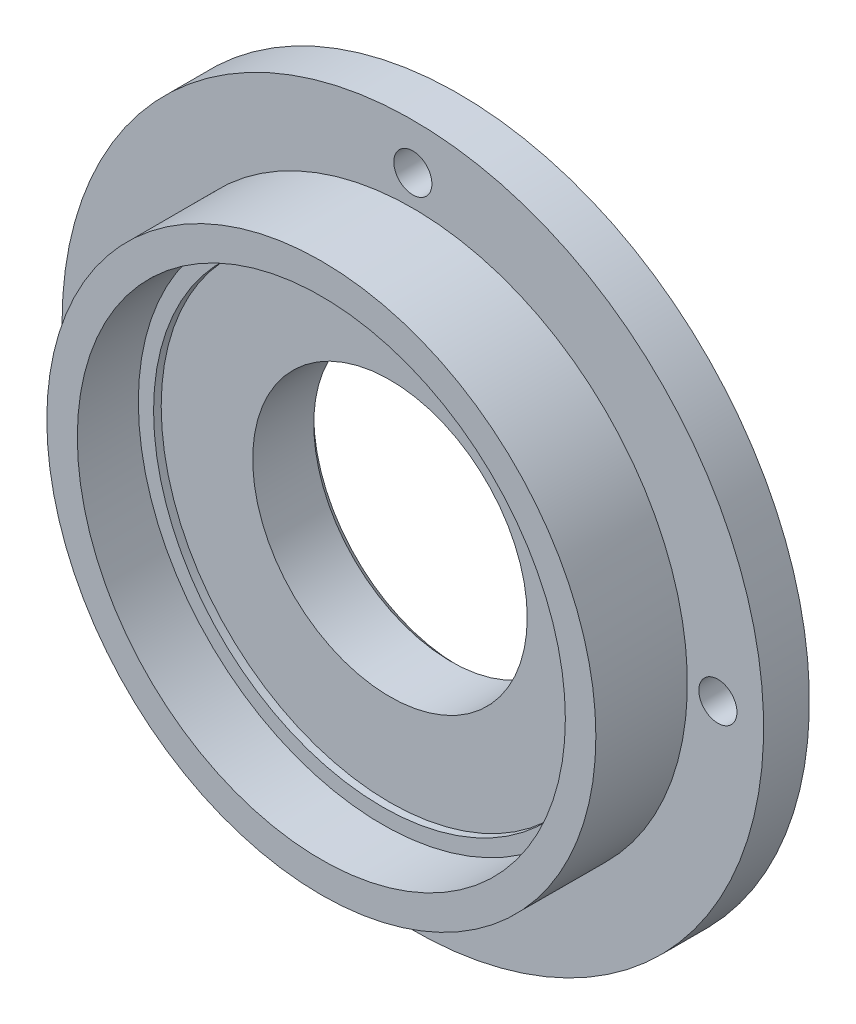
ISO-10303-21;
HEADER;
FILE_DESCRIPTION(('STEP AP214'),'2;1');
FILE_NAME('part.step','',(''),(''),'','','');
FILE_SCHEMA(('AUTOMOTIVE_DESIGN { 1 0 10303 214 1 1 1 1 }'));
ENDSEC;
DATA;
#1=APPLICATION_CONTEXT('core data for automotive mechanical design processes');
#2=APPLICATION_PROTOCOL_DEFINITION('international standard','automotive_design',2000,#1);
#3=PRODUCT_CONTEXT('',#1,'mechanical');
#4=PRODUCT('Part','Part','',(#3));
#5=PRODUCT_RELATED_PRODUCT_CATEGORY('part','',(#4));
#6=PRODUCT_DEFINITION_FORMATION('','',#4);
#7=PRODUCT_DEFINITION_CONTEXT('part definition',#1,'design');
#8=PRODUCT_DEFINITION('design','',#6,#7);
#9=PRODUCT_DEFINITION_SHAPE('','',#8);
#10=(LENGTH_UNIT() NAMED_UNIT(*) SI_UNIT(.MILLI.,.METRE.));
#11=(NAMED_UNIT(*) PLANE_ANGLE_UNIT() SI_UNIT($,.RADIAN.));
#12=(NAMED_UNIT(*) SI_UNIT($,.STERADIAN.) SOLID_ANGLE_UNIT());
#13=UNCERTAINTY_MEASURE_WITH_UNIT(LENGTH_MEASURE(1.E-05),#10,'distance_accuracy_value','');
#14=(GEOMETRIC_REPRESENTATION_CONTEXT(3) GLOBAL_UNCERTAINTY_ASSIGNED_CONTEXT((#13)) GLOBAL_UNIT_ASSIGNED_CONTEXT((#10,
#11,#12)) REPRESENTATION_CONTEXT('',''));
#15=CARTESIAN_POINT('',(0.,0.,0.));
#16=DIRECTION('',(0.,0.,1.));
#17=DIRECTION('',(1.,0.,0.));
#18=AXIS2_PLACEMENT_3D('',#15,#16,#17);
#19=CARTESIAN_POINT('',(0.,0.,0.));
#20=DIRECTION('',(0.,0.,1.));
#21=DIRECTION('',(1.,0.,0.));
#22=AXIS2_PLACEMENT_3D('',#19,#20,#21);
#23=PLANE('',#22);
#24=CARTESIAN_POINT('',(-20.,0.,0.));
#25=DIRECTION('',(0.,0.,-1.));
#26=DIRECTION('',(-1.,0.,0.));
#27=AXIS2_PLACEMENT_3D('',#24,#25,#26);
#28=CIRCLE('',#27,1.24999999999999);
#29=CARTESIAN_POINT('',(-21.25,0.,0.));
#30=VERTEX_POINT('',#29);
#31=EDGE_CURVE('E96',#30,#30,#28,.T.);
#32=ORIENTED_EDGE('',*,*,#31,.F.);
#33=EDGE_LOOP('',(#32));
#34=FACE_BOUND('',#33,.T.);
#35=CARTESIAN_POINT('',(0.,0.,0.));
#36=DIRECTION('',(0.,0.,1.));
#37=DIRECTION('',(1.,0.,0.));
#38=AXIS2_PLACEMENT_3D('',#35,#36,#37);
#39=CIRCLE('',#38,9.5);
#40=CARTESIAN_POINT('',(9.5,0.,0.));
#41=VERTEX_POINT('',#40);
#42=EDGE_CURVE('E48',#41,#41,#39,.T.);
#43=ORIENTED_EDGE('',*,*,#42,.T.);
#44=EDGE_LOOP('',(#43));
#45=FACE_BOUND('',#44,.T.);
#46=CARTESIAN_POINT('',(0.,0.,0.));
#47=DIRECTION('',(0.,0.,-1.));
#48=DIRECTION('',(-1.,0.,0.));
#49=AXIS2_PLACEMENT_3D('',#46,#47,#48);
#50=CIRCLE('',#49,23.);
#51=CARTESIAN_POINT('',(-23.,0.,0.));
#52=VERTEX_POINT('',#51);
#53=EDGE_CURVE('E87',#52,#52,#50,.T.);
#54=ORIENTED_EDGE('',*,*,#53,.T.);
#55=EDGE_LOOP('',(#54));
#56=FACE_BOUND('',#55,.T.);
#57=CARTESIAN_POINT('',(0.,-20.,0.));
#58=DIRECTION('',(0.,0.,-1.));
#59=DIRECTION('',(-1.,0.,0.));
#60=AXIS2_PLACEMENT_3D('',#57,#58,#59);
#61=CIRCLE('',#60,1.24999999999999);
#62=CARTESIAN_POINT('',(-1.24999999999999,-20.,0.));
#63=VERTEX_POINT('',#62);
#64=EDGE_CURVE('E104',#63,#63,#61,.T.);
#65=ORIENTED_EDGE('',*,*,#64,.F.);
#66=EDGE_LOOP('',(#65));
#67=FACE_BOUND('',#66,.T.);
#68=CARTESIAN_POINT('',(20.,0.,0.));
#69=DIRECTION('',(0.,0.,-1.));
#70=DIRECTION('',(-1.,0.,0.));
#71=AXIS2_PLACEMENT_3D('',#68,#69,#70);
#72=CIRCLE('',#71,1.24999999999999);
#73=CARTESIAN_POINT('',(18.75,0.,0.));
#74=VERTEX_POINT('',#73);
#75=EDGE_CURVE('E112',#74,#74,#72,.T.);
#76=ORIENTED_EDGE('',*,*,#75,.F.);
#77=EDGE_LOOP('',(#76));
#78=FACE_BOUND('',#77,.T.);
#79=CARTESIAN_POINT('',(0.,20.,0.));
#80=DIRECTION('',(0.,0.,-1.));
#81=DIRECTION('',(-1.,0.,0.));
#82=AXIS2_PLACEMENT_3D('',#79,#80,#81);
#83=CIRCLE('',#82,1.24999999999999);
#84=CARTESIAN_POINT('',(-1.24999999999999,20.,0.));
#85=VERTEX_POINT('',#84);
#86=EDGE_CURVE('E120',#85,#85,#83,.T.);
#87=ORIENTED_EDGE('',*,*,#86,.F.);
#88=EDGE_LOOP('',(#87));
#89=FACE_BOUND('',#88,.T.);
#90=ADVANCED_FACE('F40',(#34,#45,#56,#67,#78,#89),#23,.F.);
#91=CARTESIAN_POINT('',(0.,0.,9.));
#92=DIRECTION('',(0.,0.,-1.));
#93=DIRECTION('',(-1.,0.,0.));
#94=AXIS2_PLACEMENT_3D('',#91,#92,#93);
#95=CYLINDRICAL_SURFACE('',#94,18.);
#96=CARTESIAN_POINT('',(0.,0.,9.));
#97=DIRECTION('',(0.,0.,1.));
#98=DIRECTION('',(1.,0.,0.));
#99=AXIS2_PLACEMENT_3D('',#96,#97,#98);
#100=CIRCLE('',#99,18.);
#101=CARTESIAN_POINT('',(18.,0.,9.));
#102=VERTEX_POINT('',#101);
#103=EDGE_CURVE('E62',#102,#102,#100,.T.);
#104=ORIENTED_EDGE('',*,*,#103,.F.);
#105=EDGE_LOOP('',(#104));
#106=FACE_BOUND('',#105,.T.);
#107=CARTESIAN_POINT('',(0.,0.,3.));
#108=DIRECTION('',(0.,0.,-1.));
#109=DIRECTION('',(-1.,0.,0.));
#110=AXIS2_PLACEMENT_3D('',#107,#108,#109);
#111=CIRCLE('',#110,18.);
#112=CARTESIAN_POINT('',(-18.,0.,3.));
#113=VERTEX_POINT('',#112);
#114=EDGE_CURVE('E55',#113,#113,#111,.T.);
#115=ORIENTED_EDGE('',*,*,#114,.F.);
#116=EDGE_LOOP('',(#115));
#117=FACE_BOUND('',#116,.T.);
#118=ADVANCED_FACE('F128',(#106,#117),#95,.T.);
#119=CARTESIAN_POINT('',(0.,0.,9.));
#120=DIRECTION('',(0.,0.,1.));
#121=DIRECTION('',(1.,0.,0.));
#122=AXIS2_PLACEMENT_3D('',#119,#120,#121);
#123=PLANE('',#122);
#124=CARTESIAN_POINT('',(0.,0.,9.));
#125=DIRECTION('',(0.,0.,1.));
#126=DIRECTION('',(1.,0.,0.));
#127=AXIS2_PLACEMENT_3D('',#124,#125,#126);
#128=CIRCLE('',#127,16.);
#129=CARTESIAN_POINT('',(16.,0.,9.));
#130=VERTEX_POINT('',#129);
#131=EDGE_CURVE('E69',#130,#130,#128,.T.);
#132=ORIENTED_EDGE('',*,*,#131,.F.);
#133=EDGE_LOOP('',(#132));
#134=FACE_BOUND('',#133,.T.);
#135=ORIENTED_EDGE('',*,*,#103,.T.);
#136=EDGE_LOOP('',(#135));
#137=FACE_BOUND('',#136,.T.);
#138=ADVANCED_FACE('F134',(#134,#137),#123,.T.);
#139=CARTESIAN_POINT('',(0.,0.,5.));
#140=DIRECTION('',(0.,0.,1.));
#141=DIRECTION('',(1.,0.,0.));
#142=AXIS2_PLACEMENT_3D('',#139,#140,#141);
#143=CYLINDRICAL_SURFACE('',#142,16.);
#144=CARTESIAN_POINT('',(0.,0.,5.));
#145=DIRECTION('',(0.,0.,1.));
#146=DIRECTION('',(1.,0.,0.));
#147=AXIS2_PLACEMENT_3D('',#144,#145,#146);
#148=CIRCLE('',#147,16.);
#149=CARTESIAN_POINT('',(16.,0.,5.));
#150=VERTEX_POINT('',#149);
#151=EDGE_CURVE('E68',#150,#150,#148,.T.);
#152=ORIENTED_EDGE('',*,*,#151,.F.);
#153=EDGE_LOOP('',(#152));
#154=FACE_BOUND('',#153,.T.);
#155=ORIENTED_EDGE('',*,*,#131,.T.);
#156=EDGE_LOOP('',(#155));
#157=FACE_BOUND('',#156,.T.);
#158=ADVANCED_FACE('F140',(#154,#157),#143,.F.);
#159=CARTESIAN_POINT('',(0.,0.,5.));
#160=DIRECTION('',(0.,0.,1.));
#161=DIRECTION('',(1.,0.,0.));
#162=AXIS2_PLACEMENT_3D('',#159,#160,#161);
#163=PLANE('',#162);
#164=CARTESIAN_POINT('',(0.,0.,5.));
#165=DIRECTION('',(0.,0.,1.));
#166=DIRECTION('',(1.,0.,0.));
#167=AXIS2_PLACEMENT_3D('',#164,#165,#166);
#168=CIRCLE('',#167,15.);
#169=CARTESIAN_POINT('',(15.,0.,5.));
#170=VERTEX_POINT('',#169);
#171=EDGE_CURVE('E77',#170,#170,#168,.T.);
#172=ORIENTED_EDGE('',*,*,#171,.F.);
#173=EDGE_LOOP('',(#172));
#174=FACE_BOUND('',#173,.T.);
#175=ORIENTED_EDGE('',*,*,#151,.T.);
#176=EDGE_LOOP('',(#175));
#177=FACE_BOUND('',#176,.T.);
#178=ADVANCED_FACE('F144',(#174,#177),#163,.T.);
#179=CARTESIAN_POINT('',(0.,0.,4.5));
#180=DIRECTION('',(0.,0.,1.));
#181=DIRECTION('',(1.,0.,0.));
#182=AXIS2_PLACEMENT_3D('',#179,#180,#181);
#183=CYLINDRICAL_SURFACE('',#182,15.);
#184=CARTESIAN_POINT('',(0.,0.,4.5));
#185=DIRECTION('',(0.,0.,1.));
#186=DIRECTION('',(1.,0.,0.));
#187=AXIS2_PLACEMENT_3D('',#184,#185,#186);
#188=CIRCLE('',#187,15.);
#189=CARTESIAN_POINT('',(15.,0.,4.5));
#190=VERTEX_POINT('',#189);
#191=EDGE_CURVE('E73',#190,#190,#188,.T.);
#192=ORIENTED_EDGE('',*,*,#191,.F.);
#193=EDGE_LOOP('',(#192));
#194=FACE_BOUND('',#193,.T.);
#195=ORIENTED_EDGE('',*,*,#171,.T.);
#196=EDGE_LOOP('',(#195));
#197=FACE_BOUND('',#196,.T.);
#198=ADVANCED_FACE('F148',(#194,#197),#183,.F.);
#199=CARTESIAN_POINT('',(0.,0.,4.5));
#200=DIRECTION('',(0.,0.,1.));
#201=DIRECTION('',(1.,0.,0.));
#202=AXIS2_PLACEMENT_3D('',#199,#200,#201);
#203=PLANE('',#202);
#204=CARTESIAN_POINT('',(0.,0.,4.5));
#205=DIRECTION('',(0.,0.,1.));
#206=DIRECTION('',(1.,0.,0.));
#207=AXIS2_PLACEMENT_3D('',#204,#205,#206);
#208=CIRCLE('',#207,9.);
#209=CARTESIAN_POINT('',(9.,0.,4.5));
#210=VERTEX_POINT('',#209);
#211=EDGE_CURVE('E80',#210,#210,#208,.T.);
#212=ORIENTED_EDGE('',*,*,#211,.F.);
#213=EDGE_LOOP('',(#212));
#214=FACE_BOUND('',#213,.T.);
#215=ORIENTED_EDGE('',*,*,#191,.T.);
#216=EDGE_LOOP('',(#215));
#217=FACE_BOUND('',#216,.T.);
#218=ADVANCED_FACE('F152',(#214,#217),#203,.T.);
#219=CARTESIAN_POINT('',(0.,0.,0.));
#220=DIRECTION('',(0.,0.,1.));
#221=DIRECTION('',(1.,0.,0.));
#222=AXIS2_PLACEMENT_3D('',#219,#220,#221);
#223=CYLINDRICAL_SURFACE('',#222,9.);
#224=CARTESIAN_POINT('',(0.,0.,0.500000000000006));
#225=DIRECTION('',(0.,0.,1.));
#226=DIRECTION('',(1.,0.,0.));
#227=AXIS2_PLACEMENT_3D('',#224,#225,#226);
#228=CIRCLE('',#227,9.);
#229=CARTESIAN_POINT('',(9.,0.,0.500000000000006));
#230=VERTEX_POINT('',#229);
#231=EDGE_CURVE('E10',#230,#230,#228,.F.);
#232=ORIENTED_EDGE('',*,*,#231,.T.);
#233=EDGE_LOOP('',(#232));
#234=FACE_BOUND('',#233,.T.);
#235=ORIENTED_EDGE('',*,*,#211,.T.);
#236=EDGE_LOOP('',(#235));
#237=FACE_BOUND('',#236,.T.);
#238=ADVANCED_FACE('F156',(#234,#237),#223,.F.);
#239=CARTESIAN_POINT('',(0.,0.,3.));
#240=DIRECTION('',(0.,0.,-1.));
#241=DIRECTION('',(-1.,0.,0.));
#242=AXIS2_PLACEMENT_3D('',#239,#240,#241);
#243=CYLINDRICAL_SURFACE('',#242,23.);
#244=CARTESIAN_POINT('',(0.,0.,3.));
#245=DIRECTION('',(0.,0.,-1.));
#246=DIRECTION('',(-1.,0.,0.));
#247=AXIS2_PLACEMENT_3D('',#244,#245,#246);
#248=CIRCLE('',#247,23.);
#249=CARTESIAN_POINT('',(-23.,0.,3.));
#250=VERTEX_POINT('',#249);
#251=EDGE_CURVE('E86',#250,#250,#248,.T.);
#252=ORIENTED_EDGE('',*,*,#251,.T.);
#253=EDGE_LOOP('',(#252));
#254=FACE_BOUND('',#253,.T.);
#255=ORIENTED_EDGE('',*,*,#53,.F.);
#256=EDGE_LOOP('',(#255));
#257=FACE_BOUND('',#256,.T.);
#258=ADVANCED_FACE('F160',(#254,#257),#243,.T.);
#259=CARTESIAN_POINT('',(0.,0.,3.));
#260=DIRECTION('',(0.,0.,-1.));
#261=DIRECTION('',(-1.,0.,0.));
#262=AXIS2_PLACEMENT_3D('',#259,#260,#261);
#263=PLANE('',#262);
#264=CARTESIAN_POINT('',(0.,20.,3.));
#265=DIRECTION('',(0.,0.,-1.));
#266=DIRECTION('',(-1.,0.,0.));
#267=AXIS2_PLACEMENT_3D('',#264,#265,#266);
#268=CIRCLE('',#267,1.24999999999999);
#269=CARTESIAN_POINT('',(-1.24999999999999,20.,3.));
#270=VERTEX_POINT('',#269);
#271=EDGE_CURVE('E116',#270,#270,#268,.T.);
#272=ORIENTED_EDGE('',*,*,#271,.T.);
#273=EDGE_LOOP('',(#272));
#274=FACE_BOUND('',#273,.T.);
#275=CARTESIAN_POINT('',(20.,0.,3.));
#276=DIRECTION('',(0.,0.,-1.));
#277=DIRECTION('',(-1.,0.,0.));
#278=AXIS2_PLACEMENT_3D('',#275,#276,#277);
#279=CIRCLE('',#278,1.24999999999999);
#280=CARTESIAN_POINT('',(18.75,0.,3.));
#281=VERTEX_POINT('',#280);
#282=EDGE_CURVE('E108',#281,#281,#279,.T.);
#283=ORIENTED_EDGE('',*,*,#282,.T.);
#284=EDGE_LOOP('',(#283));
#285=FACE_BOUND('',#284,.T.);
#286=CARTESIAN_POINT('',(0.,-20.,3.));
#287=DIRECTION('',(0.,0.,-1.));
#288=DIRECTION('',(-1.,0.,0.));
#289=AXIS2_PLACEMENT_3D('',#286,#287,#288);
#290=CIRCLE('',#289,1.24999999999999);
#291=CARTESIAN_POINT('',(-1.25,-20.,3.));
#292=VERTEX_POINT('',#291);
#293=EDGE_CURVE('E100',#292,#292,#290,.T.);
#294=ORIENTED_EDGE('',*,*,#293,.T.);
#295=EDGE_LOOP('',(#294));
#296=FACE_BOUND('',#295,.T.);
#297=CARTESIAN_POINT('',(-20.,0.,3.));
#298=DIRECTION('',(0.,0.,-1.));
#299=DIRECTION('',(-1.,0.,0.));
#300=AXIS2_PLACEMENT_3D('',#297,#298,#299);
#301=CIRCLE('',#300,1.24999999999999);
#302=CARTESIAN_POINT('',(-21.25,0.,3.));
#303=VERTEX_POINT('',#302);
#304=EDGE_CURVE('E90',#303,#303,#301,.T.);
#305=ORIENTED_EDGE('',*,*,#304,.T.);
#306=EDGE_LOOP('',(#305));
#307=FACE_BOUND('',#306,.T.);
#308=ORIENTED_EDGE('',*,*,#114,.T.);
#309=EDGE_LOOP('',(#308));
#310=FACE_BOUND('',#309,.T.);
#311=ORIENTED_EDGE('',*,*,#251,.F.);
#312=EDGE_LOOP('',(#311));
#313=FACE_BOUND('',#312,.T.);
#314=ADVANCED_FACE('F163',(#274,#285,#296,#307,#310,#313),#263,.F.);
#315=CARTESIAN_POINT('',(0.,0.,0.));
#316=DIRECTION('',(0.,0.,-1.));
#317=DIRECTION('',(-1.,0.,0.));
#318=AXIS2_PLACEMENT_3D('',#315,#316,#317);
#319=CONICAL_SURFACE('',#318,9.5,0.785398163397445);
#320=ORIENTED_EDGE('',*,*,#231,.F.);
#321=EDGE_LOOP('',(#320));
#322=FACE_BOUND('',#321,.T.);
#323=ORIENTED_EDGE('',*,*,#42,.F.);
#324=EDGE_LOOP('',(#323));
#325=FACE_BOUND('',#324,.T.);
#326=ADVANCED_FACE('F42',(#322,#325),#319,.F.);
#327=CARTESIAN_POINT('',(-20.,0.,0.));
#328=DIRECTION('',(0.,0.,-1.));
#329=DIRECTION('',(-1.,0.,0.));
#330=AXIS2_PLACEMENT_3D('',#327,#328,#329);
#331=CYLINDRICAL_SURFACE('',#330,1.24999999999999);
#332=ORIENTED_EDGE('',*,*,#304,.F.);
#333=EDGE_LOOP('',(#332));
#334=FACE_BOUND('',#333,.T.);
#335=ORIENTED_EDGE('',*,*,#31,.T.);
#336=EDGE_LOOP('',(#335));
#337=FACE_BOUND('',#336,.T.);
#338=ADVANCED_FACE('F168',(#334,#337),#331,.F.);
#339=CARTESIAN_POINT('',(0.,-20.,0.));
#340=DIRECTION('',(0.,0.,-1.));
#341=DIRECTION('',(-1.,0.,0.));
#342=AXIS2_PLACEMENT_3D('',#339,#340,#341);
#343=CYLINDRICAL_SURFACE('',#342,1.24999999999999);
#344=ORIENTED_EDGE('',*,*,#293,.F.);
#345=EDGE_LOOP('',(#344));
#346=FACE_BOUND('',#345,.T.);
#347=ORIENTED_EDGE('',*,*,#64,.T.);
#348=EDGE_LOOP('',(#347));
#349=FACE_BOUND('',#348,.T.);
#350=ADVANCED_FACE('F171',(#346,#349),#343,.F.);
#351=CARTESIAN_POINT('',(20.,0.,0.));
#352=DIRECTION('',(0.,0.,-1.));
#353=DIRECTION('',(-1.,0.,0.));
#354=AXIS2_PLACEMENT_3D('',#351,#352,#353);
#355=CYLINDRICAL_SURFACE('',#354,1.24999999999999);
#356=ORIENTED_EDGE('',*,*,#282,.F.);
#357=EDGE_LOOP('',(#356));
#358=FACE_BOUND('',#357,.T.);
#359=ORIENTED_EDGE('',*,*,#75,.T.);
#360=EDGE_LOOP('',(#359));
#361=FACE_BOUND('',#360,.T.);
#362=ADVANCED_FACE('F175',(#358,#361),#355,.F.);
#363=CARTESIAN_POINT('',(0.,20.,0.));
#364=DIRECTION('',(0.,0.,-1.));
#365=DIRECTION('',(-1.,0.,0.));
#366=AXIS2_PLACEMENT_3D('',#363,#364,#365);
#367=CYLINDRICAL_SURFACE('',#366,1.24999999999999);
#368=ORIENTED_EDGE('',*,*,#271,.F.);
#369=EDGE_LOOP('',(#368));
#370=FACE_BOUND('',#369,.T.);
#371=ORIENTED_EDGE('',*,*,#86,.T.);
#372=EDGE_LOOP('',(#371));
#373=FACE_BOUND('',#372,.T.);
#374=ADVANCED_FACE('F125',(#370,#373),#367,.F.);
#375=CLOSED_SHELL('',(#90,#118,#138,#158,#178,#198,#218,#238,#258,#314,#326,#338,#350,#362,#374));
#376=MANIFOLD_SOLID_BREP('B2',#375);
#377=ADVANCED_BREP_SHAPE_REPRESENTATION('',(#18,#376),#14);
#378=SHAPE_DEFINITION_REPRESENTATION(#9,#377);
ENDSEC;
END-ISO-10303-21;
